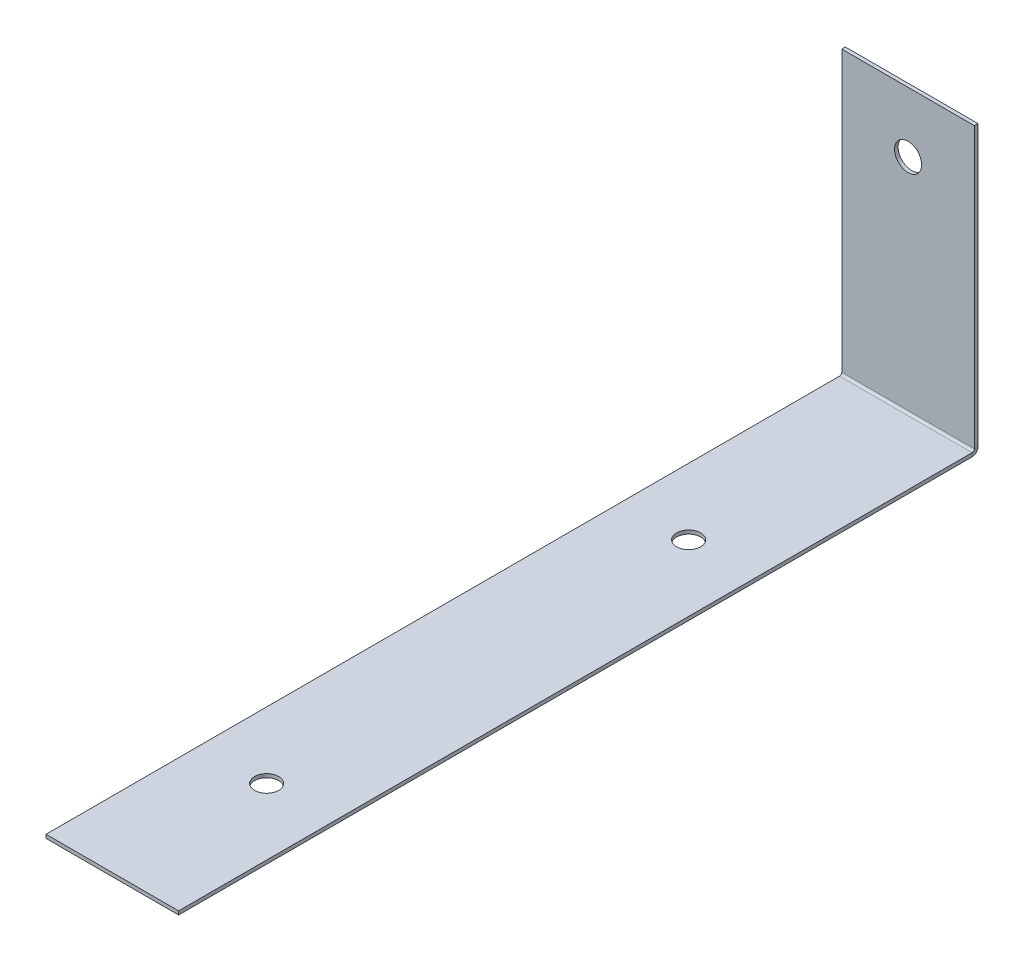
ISO-10303-21;
HEADER;
FILE_DESCRIPTION(('STEP AP214'),'2;1');
FILE_NAME('part.step','',(''),(''),'','','');
FILE_SCHEMA(('AUTOMOTIVE_DESIGN { 1 0 10303 214 1 1 1 1 }'));
ENDSEC;
DATA;
#1=APPLICATION_CONTEXT('core data for automotive mechanical design processes');
#2=APPLICATION_PROTOCOL_DEFINITION('international standard','automotive_design',2000,#1);
#3=PRODUCT_CONTEXT('',#1,'mechanical');
#4=PRODUCT('Part','Part','',(#3));
#5=PRODUCT_RELATED_PRODUCT_CATEGORY('part','',(#4));
#6=PRODUCT_DEFINITION_FORMATION('','',#4);
#7=PRODUCT_DEFINITION_CONTEXT('part definition',#1,'design');
#8=PRODUCT_DEFINITION('design','',#6,#7);
#9=PRODUCT_DEFINITION_SHAPE('','',#8);
#10=(LENGTH_UNIT() NAMED_UNIT(*) SI_UNIT(.MILLI.,.METRE.));
#11=(NAMED_UNIT(*) PLANE_ANGLE_UNIT() SI_UNIT($,.RADIAN.));
#12=(NAMED_UNIT(*) SI_UNIT($,.STERADIAN.) SOLID_ANGLE_UNIT());
#13=UNCERTAINTY_MEASURE_WITH_UNIT(LENGTH_MEASURE(1.E-05),#10,'distance_accuracy_value','');
#14=(GEOMETRIC_REPRESENTATION_CONTEXT(3) GLOBAL_UNCERTAINTY_ASSIGNED_CONTEXT((#13)) GLOBAL_UNIT_ASSIGNED_CONTEXT((#10,
#11,#12)) REPRESENTATION_CONTEXT('',''));
#15=CARTESIAN_POINT('',(0.,0.,0.));
#16=DIRECTION('',(0.,0.,1.));
#17=DIRECTION('',(1.,0.,0.));
#18=AXIS2_PLACEMENT_3D('',#15,#16,#17);
#19=CARTESIAN_POINT('',(0.,-86.4,-84.0000000000003));
#20=DIRECTION('',(0.,0.,-1.));
#21=DIRECTION('',(0.,1.,0.));
#22=AXIS2_PLACEMENT_3D('',#19,#20,#21);
#23=PLANE('',#22);
#24=CARTESIAN_POINT('',(0.,73.6,-83.9999999999998));
#25=DIRECTION('',(0.,0.,-1.));
#26=DIRECTION('',(0.,1.,0.));
#27=AXIS2_PLACEMENT_3D('',#24,#25,#26);
#28=CIRCLE('',#27,4.5);
#29=CARTESIAN_POINT('',(0.,78.1,-83.9999999999997));
#30=VERTEX_POINT('',#29);
#31=EDGE_CURVE('E210',#30,#30,#28,.T.);
#32=ORIENTED_EDGE('',*,*,#31,.T.);
#33=EDGE_LOOP('',(#32));
#34=FACE_BOUND('',#33,.T.);
#35=DIRECTION('',(0.,-1.,0.));
#36=VECTOR('',#35,1.);
#37=CARTESIAN_POINT('',(-22.,93.6,-83.9999999999997));
#38=LINE('',#37,#36);
#39=CARTESIAN_POINT('',(-22.,93.6,-83.9999999999997));
#40=VERTEX_POINT('',#39);
#41=CARTESIAN_POINT('',(-22.,0.736600000000018,-84.));
#42=VERTEX_POINT('',#41);
#43=EDGE_CURVE('E66',#40,#42,#38,.T.);
#44=ORIENTED_EDGE('',*,*,#43,.T.);
#45=DIRECTION('',(1.,0.,0.));
#46=VECTOR('',#45,1.);
#47=CARTESIAN_POINT('',(0.,0.73659999999999,-84.));
#48=LINE('',#47,#46);
#49=CARTESIAN_POINT('',(22.,0.736600000000018,-84.));
#50=VERTEX_POINT('',#49);
#51=EDGE_CURVE('E58',#42,#50,#48,.T.);
#52=ORIENTED_EDGE('',*,*,#51,.T.);
#53=DIRECTION('',(0.,1.,0.));
#54=VECTOR('',#53,1.);
#55=CARTESIAN_POINT('',(22.,93.6,-83.9999999999997));
#56=LINE('',#55,#54);
#57=CARTESIAN_POINT('',(22.,93.6,-83.9999999999997));
#58=VERTEX_POINT('',#57);
#59=EDGE_CURVE('E74',#50,#58,#56,.T.);
#60=ORIENTED_EDGE('',*,*,#59,.T.);
#61=DIRECTION('',(-1.,0.,0.));
#62=VECTOR('',#61,1.);
#63=CARTESIAN_POINT('',(22.,93.6,-83.9999999999997));
#64=LINE('',#63,#62);
#65=EDGE_CURVE('E177',#58,#40,#64,.T.);
#66=ORIENTED_EDGE('',*,*,#65,.T.);
#67=EDGE_LOOP('',(#44,#52,#60,#66));
#68=FACE_BOUND('',#67,.T.);
#69=ADVANCED_FACE('F49',(#34,#68),#23,.F.);
#70=CARTESIAN_POINT('',(-22.,93.6,-85.1999999999997));
#71=DIRECTION('',(-1.,0.,0.));
#72=DIRECTION('',(0.,-1.,0.));
#73=AXIS2_PLACEMENT_3D('',#70,#71,#72);
#74=PLANE('',#73);
#75=DIRECTION('',(0.,0.,-1.));
#76=VECTOR('',#75,1.);
#77=CARTESIAN_POINT('',(-22.,0.73659999999999,-85.2));
#78=LINE('',#77,#76);
#79=CARTESIAN_POINT('',(-22.,0.736600000000032,-85.2));
#80=VERTEX_POINT('',#79);
#81=EDGE_CURVE('E12',#42,#80,#78,.T.);
#82=ORIENTED_EDGE('',*,*,#81,.F.);
#83=ORIENTED_EDGE('',*,*,#43,.F.);
#84=DIRECTION('',(0.,0.,1.));
#85=VECTOR('',#84,1.);
#86=CARTESIAN_POINT('',(-22.,93.6,-85.1999999999997));
#87=LINE('',#86,#85);
#88=CARTESIAN_POINT('',(-22.,93.6,-85.1999999999997));
#89=VERTEX_POINT('',#88);
#90=EDGE_CURVE('E180',#89,#40,#87,.T.);
#91=ORIENTED_EDGE('',*,*,#90,.F.);
#92=DIRECTION('',(0.,-1.,0.));
#93=VECTOR('',#92,1.);
#94=CARTESIAN_POINT('',(-22.,93.6,-85.1999999999997));
#95=LINE('',#94,#93);
#96=EDGE_CURVE('E179',#89,#80,#95,.T.);
#97=ORIENTED_EDGE('',*,*,#96,.T.);
#98=EDGE_LOOP('',(#82,#83,#91,#97));
#99=FACE_BOUND('',#98,.T.);
#100=ADVANCED_FACE('F51',(#99),#74,.T.);
#101=CARTESIAN_POINT('',(22.,93.6,-85.1999999999997));
#102=DIRECTION('',(0.,1.,0.));
#103=DIRECTION('',(-1.,0.,0.));
#104=AXIS2_PLACEMENT_3D('',#101,#102,#103);
#105=PLANE('',#104);
#106=ORIENTED_EDGE('',*,*,#65,.F.);
#107=DIRECTION('',(0.,0.,1.));
#108=VECTOR('',#107,1.);
#109=CARTESIAN_POINT('',(22.,93.6,-85.1999999999997));
#110=LINE('',#109,#108);
#111=CARTESIAN_POINT('',(22.,93.6,-85.1999999999997));
#112=VERTEX_POINT('',#111);
#113=EDGE_CURVE('E175',#112,#58,#110,.T.);
#114=ORIENTED_EDGE('',*,*,#113,.F.);
#115=DIRECTION('',(-1.,0.,0.));
#116=VECTOR('',#115,1.);
#117=CARTESIAN_POINT('',(22.,93.6,-85.1999999999997));
#118=LINE('',#117,#116);
#119=EDGE_CURVE('E172',#112,#89,#118,.T.);
#120=ORIENTED_EDGE('',*,*,#119,.T.);
#121=ORIENTED_EDGE('',*,*,#90,.T.);
#122=EDGE_LOOP('',(#106,#114,#120,#121));
#123=FACE_BOUND('',#122,.T.);
#124=ADVANCED_FACE('F238',(#123),#105,.T.);
#125=CARTESIAN_POINT('',(22.,93.6,-85.1999999999997));
#126=DIRECTION('',(1.,0.,0.));
#127=DIRECTION('',(0.,1.,0.));
#128=AXIS2_PLACEMENT_3D('',#125,#126,#127);
#129=PLANE('',#128);
#130=DIRECTION('',(0.,0.,1.));
#131=VECTOR('',#130,1.);
#132=CARTESIAN_POINT('',(22.,0.73659999999999,-85.2));
#133=LINE('',#132,#131);
#134=CARTESIAN_POINT('',(22.,0.736600000000002,-85.2));
#135=VERTEX_POINT('',#134);
#136=EDGE_CURVE('E185',#135,#50,#133,.T.);
#137=ORIENTED_EDGE('',*,*,#136,.F.);
#138=DIRECTION('',(0.,1.,0.));
#139=VECTOR('',#138,1.);
#140=CARTESIAN_POINT('',(22.,93.6,-85.1999999999997));
#141=LINE('',#140,#139);
#142=EDGE_CURVE('E176',#135,#112,#141,.T.);
#143=ORIENTED_EDGE('',*,*,#142,.T.);
#144=ORIENTED_EDGE('',*,*,#113,.T.);
#145=ORIENTED_EDGE('',*,*,#59,.F.);
#146=EDGE_LOOP('',(#137,#143,#144,#145));
#147=FACE_BOUND('',#146,.T.);
#148=ADVANCED_FACE('F230',(#147),#129,.T.);
#149=CARTESIAN_POINT('',(0.,-86.4,-85.2000000000003));
#150=DIRECTION('',(0.,0.,-1.));
#151=DIRECTION('',(0.,1.,0.));
#152=AXIS2_PLACEMENT_3D('',#149,#150,#151);
#153=PLANE('',#152);
#154=CARTESIAN_POINT('',(0.,73.6,-85.1999999999997));
#155=DIRECTION('',(0.,0.,-1.));
#156=DIRECTION('',(0.,1.,0.));
#157=AXIS2_PLACEMENT_3D('',#154,#155,#156);
#158=CIRCLE('',#157,4.5);
#159=CARTESIAN_POINT('',(0.,78.1,-85.1999999999997));
#160=VERTEX_POINT('',#159);
#161=EDGE_CURVE('E199',#160,#160,#158,.T.);
#162=ORIENTED_EDGE('',*,*,#161,.F.);
#163=EDGE_LOOP('',(#162));
#164=FACE_BOUND('',#163,.T.);
#165=DIRECTION('',(1.,0.,0.));
#166=VECTOR('',#165,1.);
#167=CARTESIAN_POINT('',(0.,0.73659999999999,-85.2));
#168=LINE('',#167,#166);
#169=EDGE_CURVE('E182',#80,#135,#168,.T.);
#170=ORIENTED_EDGE('',*,*,#169,.F.);
#171=ORIENTED_EDGE('',*,*,#96,.F.);
#172=ORIENTED_EDGE('',*,*,#119,.F.);
#173=ORIENTED_EDGE('',*,*,#142,.F.);
#174=EDGE_LOOP('',(#170,#171,#172,#173));
#175=FACE_BOUND('',#174,.T.);
#176=ADVANCED_FACE('F234',(#164,#175),#153,.T.);
#177=CARTESIAN_POINT('',(22.,-1.2,180.));
#178=DIRECTION('',(0.,0.,1.));
#179=DIRECTION('',(1.,0.,0.));
#180=AXIS2_PLACEMENT_3D('',#177,#178,#179);
#181=PLANE('',#180);
#182=DIRECTION('',(1.,0.,0.));
#183=VECTOR('',#182,1.);
#184=CARTESIAN_POINT('',(22.,0.,180.));
#185=LINE('',#184,#183);
#186=CARTESIAN_POINT('',(-22.,0.,180.));
#187=VERTEX_POINT('',#186);
#188=CARTESIAN_POINT('',(22.,0.,180.));
#189=VERTEX_POINT('',#188);
#190=EDGE_CURVE('E157',#187,#189,#185,.T.);
#191=ORIENTED_EDGE('',*,*,#190,.F.);
#192=DIRECTION('',(0.,1.,0.));
#193=VECTOR('',#192,1.);
#194=CARTESIAN_POINT('',(-22.,-1.2,180.));
#195=LINE('',#194,#193);
#196=CARTESIAN_POINT('',(-22.,-1.2,180.));
#197=VERTEX_POINT('',#196);
#198=EDGE_CURVE('E148',#197,#187,#195,.T.);
#199=ORIENTED_EDGE('',*,*,#198,.F.);
#200=DIRECTION('',(1.,0.,0.));
#201=VECTOR('',#200,1.);
#202=CARTESIAN_POINT('',(22.,-1.2,180.));
#203=LINE('',#202,#201);
#204=CARTESIAN_POINT('',(22.,-1.2,180.));
#205=VERTEX_POINT('',#204);
#206=EDGE_CURVE('E144',#197,#205,#203,.T.);
#207=ORIENTED_EDGE('',*,*,#206,.T.);
#208=DIRECTION('',(0.,1.,0.));
#209=VECTOR('',#208,1.);
#210=CARTESIAN_POINT('',(22.,-1.2,180.));
#211=LINE('',#210,#209);
#212=EDGE_CURVE('E138',#205,#189,#211,.T.);
#213=ORIENTED_EDGE('',*,*,#212,.T.);
#214=EDGE_LOOP('',(#191,#199,#207,#213));
#215=FACE_BOUND('',#214,.T.);
#216=ADVANCED_FACE('F219',(#215),#181,.T.);
#217=CARTESIAN_POINT('',(0.,-1.2,0.));
#218=DIRECTION('',(0.,-1.,0.));
#219=DIRECTION('',(0.,0.,-1.));
#220=AXIS2_PLACEMENT_3D('',#217,#218,#219);
#221=PLANE('',#220);
#222=CARTESIAN_POINT('',(0.,-1.2,-11.2));
#223=DIRECTION('',(0.,-1.,0.));
#224=DIRECTION('',(0.,0.,-1.));
#225=AXIS2_PLACEMENT_3D('',#222,#223,#224);
#226=CIRCLE('',#225,4.);
#227=CARTESIAN_POINT('',(0.,-1.2,-15.2));
#228=VERTEX_POINT('',#227);
#229=EDGE_CURVE('E195',#228,#228,#226,.T.);
#230=ORIENTED_EDGE('',*,*,#229,.F.);
#231=EDGE_LOOP('',(#230));
#232=FACE_BOUND('',#231,.T.);
#233=CARTESIAN_POINT('',(0.,-1.2,128.8));
#234=DIRECTION('',(0.,-1.,0.));
#235=DIRECTION('',(0.,0.,-1.));
#236=AXIS2_PLACEMENT_3D('',#233,#234,#235);
#237=CIRCLE('',#236,4.);
#238=CARTESIAN_POINT('',(0.,-1.2,124.8));
#239=VERTEX_POINT('',#238);
#240=EDGE_CURVE('E201',#239,#239,#237,.T.);
#241=ORIENTED_EDGE('',*,*,#240,.F.);
#242=EDGE_LOOP('',(#241));
#243=FACE_BOUND('',#242,.T.);
#244=DIRECTION('',(0.,0.,1.));
#245=VECTOR('',#244,1.);
#246=CARTESIAN_POINT('',(-22.,-1.2,-180.));
#247=LINE('',#246,#245);
#248=CARTESIAN_POINT('',(-22.,-1.2,-83.2634));
#249=VERTEX_POINT('',#248);
#250=EDGE_CURVE('E141',#249,#197,#247,.T.);
#251=ORIENTED_EDGE('',*,*,#250,.F.);
#252=DIRECTION('',(1.,0.,0.));
#253=VECTOR('',#252,1.);
#254=CARTESIAN_POINT('',(0.,-1.2,-83.2634));
#255=LINE('',#254,#253);
#256=CARTESIAN_POINT('',(22.,-1.2,-83.2634));
#257=VERTEX_POINT('',#256);
#258=EDGE_CURVE('E130',#249,#257,#255,.T.);
#259=ORIENTED_EDGE('',*,*,#258,.T.);
#260=DIRECTION('',(0.,0.,-1.));
#261=VECTOR('',#260,1.);
#262=CARTESIAN_POINT('',(22.,-1.2,-180.));
#263=LINE('',#262,#261);
#264=EDGE_CURVE('E137',#205,#257,#263,.T.);
#265=ORIENTED_EDGE('',*,*,#264,.F.);
#266=ORIENTED_EDGE('',*,*,#206,.F.);
#267=EDGE_LOOP('',(#251,#259,#265,#266));
#268=FACE_BOUND('',#267,.T.);
#269=ADVANCED_FACE('F142',(#232,#243,#268),#221,.T.);
#270=CARTESIAN_POINT('',(22.,-1.2,-180.));
#271=DIRECTION('',(1.,0.,0.));
#272=DIRECTION('',(0.,0.,-1.));
#273=AXIS2_PLACEMENT_3D('',#270,#271,#272);
#274=PLANE('',#273);
#275=ORIENTED_EDGE('',*,*,#264,.T.);
#276=DIRECTION('',(0.,1.,0.));
#277=VECTOR('',#276,1.);
#278=CARTESIAN_POINT('',(22.,-1.19999999999999,-83.2634));
#279=LINE('',#278,#277);
#280=CARTESIAN_POINT('',(22.,0.,-83.2634));
#281=VERTEX_POINT('',#280);
#282=EDGE_CURVE('E164',#257,#281,#279,.T.);
#283=ORIENTED_EDGE('',*,*,#282,.T.);
#284=DIRECTION('',(0.,0.,-1.));
#285=VECTOR('',#284,1.);
#286=CARTESIAN_POINT('',(22.,0.,-180.));
#287=LINE('',#286,#285);
#288=EDGE_CURVE('E154',#189,#281,#287,.T.);
#289=ORIENTED_EDGE('',*,*,#288,.F.);
#290=ORIENTED_EDGE('',*,*,#212,.F.);
#291=EDGE_LOOP('',(#275,#283,#289,#290));
#292=FACE_BOUND('',#291,.T.);
#293=ADVANCED_FACE('F258',(#292),#274,.T.);
#294=CARTESIAN_POINT('',(0.,0.,0.));
#295=DIRECTION('',(0.,-1.,0.));
#296=DIRECTION('',(0.,0.,-1.));
#297=AXIS2_PLACEMENT_3D('',#294,#295,#296);
#298=PLANE('',#297);
#299=CARTESIAN_POINT('',(0.,0.,-11.2));
#300=DIRECTION('',(0.,-1.,0.));
#301=DIRECTION('',(0.,0.,-1.));
#302=AXIS2_PLACEMENT_3D('',#299,#300,#301);
#303=CIRCLE('',#302,4.);
#304=CARTESIAN_POINT('',(0.,0.,-15.2));
#305=VERTEX_POINT('',#304);
#306=EDGE_CURVE('E53',#305,#305,#303,.T.);
#307=ORIENTED_EDGE('',*,*,#306,.T.);
#308=EDGE_LOOP('',(#307));
#309=FACE_BOUND('',#308,.T.);
#310=CARTESIAN_POINT('',(0.,0.,128.8));
#311=DIRECTION('',(0.,-1.,0.));
#312=DIRECTION('',(0.,0.,-1.));
#313=AXIS2_PLACEMENT_3D('',#310,#311,#312);
#314=CIRCLE('',#313,4.);
#315=CARTESIAN_POINT('',(0.,0.,124.8));
#316=VERTEX_POINT('',#315);
#317=EDGE_CURVE('E193',#316,#316,#314,.T.);
#318=ORIENTED_EDGE('',*,*,#317,.T.);
#319=EDGE_LOOP('',(#318));
#320=FACE_BOUND('',#319,.T.);
#321=DIRECTION('',(1.,0.,0.));
#322=VECTOR('',#321,1.);
#323=CARTESIAN_POINT('',(0.,0.,-83.2634));
#324=LINE('',#323,#322);
#325=CARTESIAN_POINT('',(-22.,0.,-83.2634));
#326=VERTEX_POINT('',#325);
#327=EDGE_CURVE('E170',#326,#281,#324,.T.);
#328=ORIENTED_EDGE('',*,*,#327,.F.);
#329=DIRECTION('',(0.,0.,1.));
#330=VECTOR('',#329,1.);
#331=CARTESIAN_POINT('',(-22.,0.,-180.));
#332=LINE('',#331,#330);
#333=EDGE_CURVE('E152',#326,#187,#332,.T.);
#334=ORIENTED_EDGE('',*,*,#333,.T.);
#335=ORIENTED_EDGE('',*,*,#190,.T.);
#336=ORIENTED_EDGE('',*,*,#288,.T.);
#337=EDGE_LOOP('',(#328,#334,#335,#336));
#338=FACE_BOUND('',#337,.T.);
#339=ADVANCED_FACE('F222',(#309,#320,#338),#298,.F.);
#340=CARTESIAN_POINT('',(-22.,-1.2,-180.));
#341=DIRECTION('',(-1.,0.,0.));
#342=DIRECTION('',(0.,0.,1.));
#343=AXIS2_PLACEMENT_3D('',#340,#341,#342);
#344=PLANE('',#343);
#345=ORIENTED_EDGE('',*,*,#333,.F.);
#346=DIRECTION('',(0.,-1.,0.));
#347=VECTOR('',#346,1.);
#348=CARTESIAN_POINT('',(-22.,-1.19999999999999,-83.2634));
#349=LINE('',#348,#347);
#350=EDGE_CURVE('E121',#326,#249,#349,.T.);
#351=ORIENTED_EDGE('',*,*,#350,.T.);
#352=ORIENTED_EDGE('',*,*,#250,.T.);
#353=ORIENTED_EDGE('',*,*,#198,.T.);
#354=EDGE_LOOP('',(#345,#351,#352,#353));
#355=FACE_BOUND('',#354,.T.);
#356=ADVANCED_FACE('F151',(#355),#344,.T.);
#357=CARTESIAN_POINT('',(-22.,0.7366,-83.2634));
#358=DIRECTION('',(-1.,0.,0.));
#359=DIRECTION('',(0.,0.,1.));
#360=AXIS2_PLACEMENT_3D('',#357,#358,#359);
#361=PLANE('',#360);
#362=ORIENTED_EDGE('',*,*,#350,.F.);
#363=CARTESIAN_POINT('',(-22.,0.7366,-83.2634));
#364=DIRECTION('',(1.,0.,0.));
#365=DIRECTION('',(0.,0.,-1.));
#366=AXIS2_PLACEMENT_3D('',#363,#364,#365);
#367=CIRCLE('',#366,0.7366);
#368=EDGE_CURVE('E212',#326,#42,#367,.T.);
#369=ORIENTED_EDGE('',*,*,#368,.T.);
#370=ORIENTED_EDGE('',*,*,#81,.T.);
#371=CARTESIAN_POINT('',(-22.,0.7366,-83.2634));
#372=DIRECTION('',(1.,0.,0.));
#373=DIRECTION('',(0.,0.,1.));
#374=AXIS2_PLACEMENT_3D('',#371,#372,#373);
#375=CIRCLE('',#374,1.9366);
#376=EDGE_CURVE('E116',#249,#80,#375,.T.);
#377=ORIENTED_EDGE('',*,*,#376,.F.);
#378=EDGE_LOOP('',(#362,#369,#370,#377));
#379=FACE_BOUND('',#378,.T.);
#380=ADVANCED_FACE('F118',(#379),#361,.T.);
#381=CARTESIAN_POINT('',(22.,0.7366,-83.2634));
#382=DIRECTION('',(1.,0.,0.));
#383=DIRECTION('',(0.,0.,-1.));
#384=AXIS2_PLACEMENT_3D('',#381,#382,#383);
#385=PLANE('',#384);
#386=ORIENTED_EDGE('',*,*,#136,.T.);
#387=CARTESIAN_POINT('',(22.,0.7366,-83.2634));
#388=DIRECTION('',(1.,0.,0.));
#389=DIRECTION('',(0.,0.,-1.));
#390=AXIS2_PLACEMENT_3D('',#387,#388,#389);
#391=CIRCLE('',#390,0.7366);
#392=EDGE_CURVE('E126',#50,#281,#391,.F.);
#393=ORIENTED_EDGE('',*,*,#392,.T.);
#394=ORIENTED_EDGE('',*,*,#282,.F.);
#395=CARTESIAN_POINT('',(22.,0.7366,-83.2634));
#396=DIRECTION('',(-1.,0.,0.));
#397=DIRECTION('',(0.,0.,-1.));
#398=AXIS2_PLACEMENT_3D('',#395,#396,#397);
#399=CIRCLE('',#398,1.9366);
#400=EDGE_CURVE('E125',#135,#257,#399,.T.);
#401=ORIENTED_EDGE('',*,*,#400,.F.);
#402=EDGE_LOOP('',(#386,#393,#394,#401));
#403=FACE_BOUND('',#402,.T.);
#404=ADVANCED_FACE('F228',(#403),#385,.T.);
#405=CARTESIAN_POINT('',(-44.1864422446524,0.7366,-83.2634));
#406=DIRECTION('',(1.,0.,0.));
#407=DIRECTION('',(0.,0.,-1.));
#408=AXIS2_PLACEMENT_3D('',#405,#406,#407);
#409=CYLINDRICAL_SURFACE('',#408,1.9366);
#410=ORIENTED_EDGE('',*,*,#400,.T.);
#411=ORIENTED_EDGE('',*,*,#258,.F.);
#412=ORIENTED_EDGE('',*,*,#376,.T.);
#413=ORIENTED_EDGE('',*,*,#169,.T.);
#414=EDGE_LOOP('',(#410,#411,#412,#413));
#415=FACE_BOUND('',#414,.T.);
#416=ADVANCED_FACE('F132',(#415),#409,.T.);
#417=CARTESIAN_POINT('',(-44.1864422446524,0.7366,-83.2634));
#418=DIRECTION('',(1.,0.,0.));
#419=DIRECTION('',(0.,0.,-1.));
#420=AXIS2_PLACEMENT_3D('',#417,#418,#419);
#421=CYLINDRICAL_SURFACE('',#420,0.7366);
#422=ORIENTED_EDGE('',*,*,#392,.F.);
#423=ORIENTED_EDGE('',*,*,#51,.F.);
#424=ORIENTED_EDGE('',*,*,#368,.F.);
#425=ORIENTED_EDGE('',*,*,#327,.T.);
#426=EDGE_LOOP('',(#422,#423,#424,#425));
#427=FACE_BOUND('',#426,.T.);
#428=ADVANCED_FACE('F225',(#427),#421,.F.);
#429=CARTESIAN_POINT('',(0.,73.5999999999999,-75.1999999999997));
#430=DIRECTION('',(0.,0.,-1.));
#431=DIRECTION('',(0.,1.,0.));
#432=AXIS2_PLACEMENT_3D('',#429,#430,#431);
#433=CYLINDRICAL_SURFACE('',#432,4.5);
#434=ORIENTED_EDGE('',*,*,#161,.T.);
#435=EDGE_LOOP('',(#434));
#436=FACE_BOUND('',#435,.T.);
#437=ORIENTED_EDGE('',*,*,#31,.F.);
#438=EDGE_LOOP('',(#437));
#439=FACE_BOUND('',#438,.T.);
#440=ADVANCED_FACE('F273',(#436,#439),#433,.F.);
#441=CARTESIAN_POINT('',(0.,8.8,128.8));
#442=DIRECTION('',(0.,-1.,0.));
#443=DIRECTION('',(0.,0.,-1.));
#444=AXIS2_PLACEMENT_3D('',#441,#442,#443);
#445=CYLINDRICAL_SURFACE('',#444,4.);
#446=ORIENTED_EDGE('',*,*,#240,.T.);
#447=EDGE_LOOP('',(#446));
#448=FACE_BOUND('',#447,.T.);
#449=ORIENTED_EDGE('',*,*,#317,.F.);
#450=EDGE_LOOP('',(#449));
#451=FACE_BOUND('',#450,.T.);
#452=ADVANCED_FACE('F278',(#448,#451),#445,.F.);
#453=CARTESIAN_POINT('',(0.,8.8,-11.2));
#454=DIRECTION('',(0.,-1.,0.));
#455=DIRECTION('',(0.,0.,-1.));
#456=AXIS2_PLACEMENT_3D('',#453,#454,#455);
#457=CYLINDRICAL_SURFACE('',#456,4.);
#458=ORIENTED_EDGE('',*,*,#229,.T.);
#459=EDGE_LOOP('',(#458));
#460=FACE_BOUND('',#459,.T.);
#461=ORIENTED_EDGE('',*,*,#306,.F.);
#462=EDGE_LOOP('',(#461));
#463=FACE_BOUND('',#462,.T.);
#464=ADVANCED_FACE('F282',(#460,#463),#457,.F.);
#465=CLOSED_SHELL('',(#69,#100,#124,#148,#176,#216,#269,#293,#339,#356,#380,#404,#416,#428,#440,
#452,#464));
#466=MANIFOLD_SOLID_BREP('B2',#465);
#467=ADVANCED_BREP_SHAPE_REPRESENTATION('',(#18,#466),#14);
#468=SHAPE_DEFINITION_REPRESENTATION(#9,#467);
ENDSEC;
END-ISO-10303-21;
